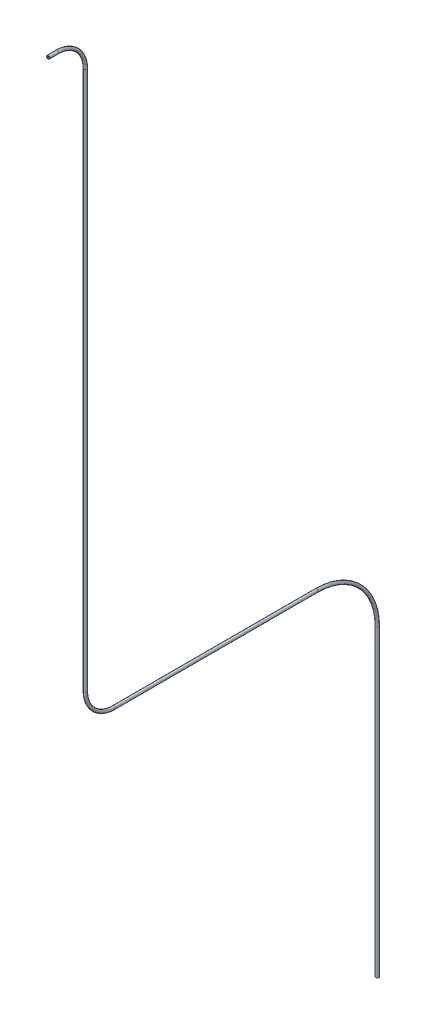
ISO-10303-21;
HEADER;
FILE_DESCRIPTION(('STEP AP214'),'2;1');
FILE_NAME('part.step','',(''),(''),'','','');
FILE_SCHEMA(('AUTOMOTIVE_DESIGN { 1 0 10303 214 1 1 1 1 }'));
ENDSEC;
DATA;
#1=APPLICATION_CONTEXT('core data for automotive mechanical design processes');
#2=APPLICATION_PROTOCOL_DEFINITION('international standard','automotive_design',2000,#1);
#3=PRODUCT_CONTEXT('',#1,'mechanical');
#4=PRODUCT('Part','Part','',(#3));
#5=PRODUCT_RELATED_PRODUCT_CATEGORY('part','',(#4));
#6=PRODUCT_DEFINITION_FORMATION('','',#4);
#7=PRODUCT_DEFINITION_CONTEXT('part definition',#1,'design');
#8=PRODUCT_DEFINITION('design','',#6,#7);
#9=PRODUCT_DEFINITION_SHAPE('','',#8);
#10=(LENGTH_UNIT() NAMED_UNIT(*) SI_UNIT(.MILLI.,.METRE.));
#11=(NAMED_UNIT(*) PLANE_ANGLE_UNIT() SI_UNIT($,.RADIAN.));
#12=(NAMED_UNIT(*) SI_UNIT($,.STERADIAN.) SOLID_ANGLE_UNIT());
#13=UNCERTAINTY_MEASURE_WITH_UNIT(LENGTH_MEASURE(1.E-05),#10,'distance_accuracy_value','');
#14=(GEOMETRIC_REPRESENTATION_CONTEXT(3) GLOBAL_UNCERTAINTY_ASSIGNED_CONTEXT((#13)) GLOBAL_UNIT_ASSIGNED_CONTEXT((#10,
#11,#12)) REPRESENTATION_CONTEXT('',''));
#15=CARTESIAN_POINT('',(0.,0.,0.));
#16=DIRECTION('',(0.,0.,1.));
#17=DIRECTION('',(1.,0.,0.));
#18=AXIS2_PLACEMENT_3D('',#15,#16,#17);
#19=CARTESIAN_POINT('',(0.,0.,0.));
#20=DIRECTION('',(0.,0.,1.));
#21=DIRECTION('',(-1.,0.,0.));
#22=AXIS2_PLACEMENT_3D('',#19,#20,#21);
#23=PLANE('',#22);
#24=CARTESIAN_POINT('',(0.,0.,0.));
#25=DIRECTION('',(0.,0.,1.));
#26=DIRECTION('',(-1.,0.,0.));
#27=AXIS2_PLACEMENT_3D('',#24,#25,#26);
#28=CIRCLE('',#27,0.19);
#29=CARTESIAN_POINT('',(-0.19,0.,0.));
#30=VERTEX_POINT('',#29);
#31=EDGE_CURVE('E261',#30,#30,#28,.T.);
#32=ORIENTED_EDGE('',*,*,#31,.F.);
#33=EDGE_LOOP('',(#32));
#34=FACE_BOUND('',#33,.T.);
#35=CARTESIAN_POINT('',(0.,0.,0.));
#36=DIRECTION('',(0.,0.,1.));
#37=DIRECTION('',(0.,-1.,0.));
#38=AXIS2_PLACEMENT_3D('',#35,#36,#37);
#39=CIRCLE('',#38,0.39);
#40=CARTESIAN_POINT('',(0.,-0.39,0.));
#41=VERTEX_POINT('',#40);
#42=EDGE_CURVE('E70',#41,#41,#39,.T.);
#43=ORIENTED_EDGE('',*,*,#42,.T.);
#44=EDGE_LOOP('',(#43));
#45=FACE_BOUND('',#44,.T.);
#46=ADVANCED_FACE('F51',(#34,#45),#23,.T.);
#47=CARTESIAN_POINT('',(0.,-237.,-81.2));
#48=DIRECTION('',(0.,1.,0.));
#49=DIRECTION('',(-1.,0.,0.));
#50=AXIS2_PLACEMENT_3D('',#47,#48,#49);
#51=PLANE('',#50);
#52=CARTESIAN_POINT('',(0.,-237.,-81.2));
#53=DIRECTION('',(0.,1.,0.));
#54=DIRECTION('',(-1.,0.,0.));
#55=AXIS2_PLACEMENT_3D('',#52,#53,#54);
#56=CIRCLE('',#55,0.19);
#57=CARTESIAN_POINT('',(-0.19,-237.,-81.2));
#58=VERTEX_POINT('',#57);
#59=EDGE_CURVE('E73',#58,#58,#56,.T.);
#60=ORIENTED_EDGE('',*,*,#59,.T.);
#61=EDGE_LOOP('',(#60));
#62=FACE_BOUND('',#61,.T.);
#63=CARTESIAN_POINT('',(0.,-237.,-81.2));
#64=DIRECTION('',(0.,1.,0.));
#65=DIRECTION('',(-1.,0.,0.));
#66=AXIS2_PLACEMENT_3D('',#63,#64,#65);
#67=CIRCLE('',#66,0.39);
#68=CARTESIAN_POINT('',(-0.39,-237.,-81.2));
#69=VERTEX_POINT('',#68);
#70=EDGE_CURVE('E11',#69,#69,#67,.T.);
#71=ORIENTED_EDGE('',*,*,#70,.F.);
#72=EDGE_LOOP('',(#71));
#73=FACE_BOUND('',#72,.T.);
#74=ADVANCED_FACE('F147',(#62,#73),#51,.F.);
#75=CARTESIAN_POINT('',(0.,0.,0.));
#76=DIRECTION('',(0.,0.,-1.));
#77=DIRECTION('',(-1.,0.,0.));
#78=AXIS2_PLACEMENT_3D('',#75,#76,#77);
#79=CYLINDRICAL_SURFACE('',#78,0.39);
#80=CARTESIAN_POINT('',(0.,0.,-2.20000000000001));
#81=DIRECTION('',(0.,0.,-1.));
#82=DIRECTION('',(-1.,0.,0.));
#83=AXIS2_PLACEMENT_3D('',#80,#81,#82);
#84=CIRCLE('',#83,0.39);
#85=CARTESIAN_POINT('',(0.,0.389999999999999,-2.20000000000001));
#86=VERTEX_POINT('',#85);
#87=EDGE_CURVE('E72',#86,#86,#84,.F.);
#88=ORIENTED_EDGE('',*,*,#87,.T.);
#89=EDGE_LOOP('',(#88));
#90=FACE_BOUND('',#89,.T.);
#91=ORIENTED_EDGE('',*,*,#42,.F.);
#92=EDGE_LOOP('',(#91));
#93=FACE_BOUND('',#92,.T.);
#94=ADVANCED_FACE('F150',(#90,#93),#79,.T.);
#95=CARTESIAN_POINT('',(0.,-7.,-2.2));
#96=DIRECTION('',(-1.,0.,0.));
#97=DIRECTION('',(0.,0.,1.));
#98=AXIS2_PLACEMENT_3D('',#95,#96,#97);
#99=TOROIDAL_SURFACE('',#98,7.,0.39);
#100=CARTESIAN_POINT('',(0.,-6.99999999999981,-9.2));
#101=DIRECTION('',(0.,1.,0.));
#102=DIRECTION('',(0.,0.,1.));
#103=AXIS2_PLACEMENT_3D('',#100,#101,#102);
#104=CIRCLE('',#103,0.39);
#105=CARTESIAN_POINT('',(0.,-6.9999999999998,-9.59));
#106=VERTEX_POINT('',#105);
#107=EDGE_CURVE('E77',#106,#106,#104,.T.);
#108=CARTESIAN_POINT('',(0.,-7.,-2.2));
#109=DIRECTION('',(-1.,0.,0.));
#110=DIRECTION('',(0.,0.,1.));
#111=AXIS2_PLACEMENT_3D('',#108,#109,#110);
#112=CIRCLE('',#111,7.39);
#113=EDGE_CURVE('',#86,#106,#112,.T.);
#114=ORIENTED_EDGE('',*,*,#87,.F.);
#115=ORIENTED_EDGE('',*,*,#107,.T.);
#116=ORIENTED_EDGE('',*,*,#113,.T.);
#117=ORIENTED_EDGE('',*,*,#113,.F.);
#118=EDGE_LOOP('',(#114,#116,#115,#117));
#119=FACE_BOUND('',#118,.T.);
#120=ADVANCED_FACE('F156',(#119),#99,.T.);
#121=CARTESIAN_POINT('',(0.,-7.00000000000006,-9.19999999999996));
#122=DIRECTION('',(0.,-1.,0.));
#123=DIRECTION('',(0.,0.,-1.));
#124=AXIS2_PLACEMENT_3D('',#121,#122,#123);
#125=CYLINDRICAL_SURFACE('',#124,0.39);
#126=CARTESIAN_POINT('',(0.,-140.,-9.19999999999996));
#127=DIRECTION('',(0.,-1.,0.));
#128=DIRECTION('',(0.,0.,-1.));
#129=AXIS2_PLACEMENT_3D('',#126,#127,#128);
#130=CIRCLE('',#129,0.39);
#131=CARTESIAN_POINT('',(0.,-140.,-8.80999999999996));
#132=VERTEX_POINT('',#131);
#133=EDGE_CURVE('E91',#132,#132,#130,.F.);
#134=ORIENTED_EDGE('',*,*,#133,.T.);
#135=EDGE_LOOP('',(#134));
#136=FACE_BOUND('',#135,.T.);
#137=ORIENTED_EDGE('',*,*,#107,.F.);
#138=EDGE_LOOP('',(#137));
#139=FACE_BOUND('',#138,.T.);
#140=ADVANCED_FACE('F108',(#136,#139),#125,.T.);
#141=CARTESIAN_POINT('',(0.,-140.,-16.2));
#142=DIRECTION('',(1.,0.,0.));
#143=DIRECTION('',(0.,0.,-1.));
#144=AXIS2_PLACEMENT_3D('',#141,#142,#143);
#145=TOROIDAL_SURFACE('',#144,7.00000000000002,0.39);
#146=CARTESIAN_POINT('',(0.,-147.,-16.2));
#147=DIRECTION('',(0.,0.,1.));
#148=DIRECTION('',(0.,-1.,0.));
#149=AXIS2_PLACEMENT_3D('',#146,#147,#148);
#150=CIRCLE('',#149,0.39);
#151=CARTESIAN_POINT('',(0.,-147.39,-16.2));
#152=VERTEX_POINT('',#151);
#153=EDGE_CURVE('E67',#152,#152,#150,.T.);
#154=CARTESIAN_POINT('',(0.,-140.,-16.2));
#155=DIRECTION('',(1.,0.,0.));
#156=DIRECTION('',(0.,0.,-1.));
#157=AXIS2_PLACEMENT_3D('',#154,#155,#156);
#158=CIRCLE('',#157,7.39000000000002);
#159=EDGE_CURVE('',#132,#152,#158,.T.);
#160=ORIENTED_EDGE('',*,*,#133,.F.);
#161=ORIENTED_EDGE('',*,*,#153,.T.);
#162=ORIENTED_EDGE('',*,*,#159,.T.);
#163=ORIENTED_EDGE('',*,*,#159,.F.);
#164=EDGE_LOOP('',(#160,#162,#161,#163));
#165=FACE_BOUND('',#164,.T.);
#166=ADVANCED_FACE('F96',(#165),#145,.T.);
#167=CARTESIAN_POINT('',(0.,-147.,-16.2));
#168=DIRECTION('',(0.,0.,-1.));
#169=DIRECTION('',(-1.,0.,0.));
#170=AXIS2_PLACEMENT_3D('',#167,#168,#169);
#171=CYLINDRICAL_SURFACE('',#170,0.39);
#172=CARTESIAN_POINT('',(0.,-147.,-66.2));
#173=DIRECTION('',(0.,0.,-1.));
#174=DIRECTION('',(-1.,0.,0.));
#175=AXIS2_PLACEMENT_3D('',#172,#173,#174);
#176=CIRCLE('',#175,0.39);
#177=CARTESIAN_POINT('',(0.,-146.61,-66.2));
#178=VERTEX_POINT('',#177);
#179=EDGE_CURVE('E62',#178,#178,#176,.F.);
#180=ORIENTED_EDGE('',*,*,#179,.T.);
#181=EDGE_LOOP('',(#180));
#182=FACE_BOUND('',#181,.T.);
#183=ORIENTED_EDGE('',*,*,#153,.F.);
#184=EDGE_LOOP('',(#183));
#185=FACE_BOUND('',#184,.T.);
#186=ADVANCED_FACE('F99',(#182,#185),#171,.T.);
#187=CARTESIAN_POINT('',(0.,-162.,-66.2));
#188=DIRECTION('',(-1.,0.,0.));
#189=DIRECTION('',(0.,0.,1.));
#190=AXIS2_PLACEMENT_3D('',#187,#188,#189);
#191=TOROIDAL_SURFACE('',#190,15.,0.39);
#192=CARTESIAN_POINT('',(0.,-162.,-81.2));
#193=DIRECTION('',(0.,1.,0.));
#194=DIRECTION('',(0.,0.,1.));
#195=AXIS2_PLACEMENT_3D('',#192,#193,#194);
#196=CIRCLE('',#195,0.39);
#197=CARTESIAN_POINT('',(0.,-162.,-81.59));
#198=VERTEX_POINT('',#197);
#199=EDGE_CURVE('E58',#198,#198,#196,.T.);
#200=CARTESIAN_POINT('',(0.,-162.,-66.2));
#201=DIRECTION('',(-1.,0.,0.));
#202=DIRECTION('',(0.,0.,1.));
#203=AXIS2_PLACEMENT_3D('',#200,#201,#202);
#204=CIRCLE('',#203,15.39);
#205=EDGE_CURVE('',#178,#198,#204,.T.);
#206=ORIENTED_EDGE('',*,*,#179,.F.);
#207=ORIENTED_EDGE('',*,*,#199,.T.);
#208=ORIENTED_EDGE('',*,*,#205,.T.);
#209=ORIENTED_EDGE('',*,*,#205,.F.);
#210=EDGE_LOOP('',(#206,#208,#207,#209));
#211=FACE_BOUND('',#210,.T.);
#212=ADVANCED_FACE('F101',(#211),#191,.T.);
#213=CARTESIAN_POINT('',(0.,-162.,-81.2));
#214=DIRECTION('',(0.,-1.,0.));
#215=DIRECTION('',(0.,0.,-1.));
#216=AXIS2_PLACEMENT_3D('',#213,#214,#215);
#217=CYLINDRICAL_SURFACE('',#216,0.39);
#218=ORIENTED_EDGE('',*,*,#70,.T.);
#219=EDGE_LOOP('',(#218));
#220=FACE_BOUND('',#219,.T.);
#221=ORIENTED_EDGE('',*,*,#199,.F.);
#222=EDGE_LOOP('',(#221));
#223=FACE_BOUND('',#222,.T.);
#224=ADVANCED_FACE('F53',(#220,#223),#217,.T.);
#225=CARTESIAN_POINT('',(0.,0.,0.));
#226=DIRECTION('',(0.,0.,-1.));
#227=DIRECTION('',(-1.,0.,0.));
#228=AXIS2_PLACEMENT_3D('',#225,#226,#227);
#229=CYLINDRICAL_SURFACE('',#228,0.19);
#230=CARTESIAN_POINT('',(0.,0.,-2.20000000000001));
#231=DIRECTION('',(0.,0.,1.));
#232=DIRECTION('',(-1.,0.,0.));
#233=AXIS2_PLACEMENT_3D('',#230,#231,#232);
#234=CIRCLE('',#233,0.19);
#235=CARTESIAN_POINT('',(0.,0.189999999999999,-2.20000000000001));
#236=VERTEX_POINT('',#235);
#237=EDGE_CURVE('E262',#236,#236,#234,.T.);
#238=ORIENTED_EDGE('',*,*,#237,.F.);
#239=EDGE_LOOP('',(#238));
#240=FACE_BOUND('',#239,.T.);
#241=ORIENTED_EDGE('',*,*,#31,.T.);
#242=EDGE_LOOP('',(#241));
#243=FACE_BOUND('',#242,.T.);
#244=ADVANCED_FACE('F111',(#240,#243),#229,.F.);
#245=CARTESIAN_POINT('',(0.,-7.,-2.2));
#246=DIRECTION('',(-1.,0.,0.));
#247=DIRECTION('',(0.,0.,1.));
#248=AXIS2_PLACEMENT_3D('',#245,#246,#247);
#249=TOROIDAL_SURFACE('',#248,7.,0.19);
#250=CARTESIAN_POINT('',(0.,-6.99999999999981,-9.20000000000078));
#251=DIRECTION('',(0.,1.,0.));
#252=DIRECTION('',(-1.,0.,0.));
#253=AXIS2_PLACEMENT_3D('',#250,#251,#252);
#254=CIRCLE('',#253,0.19);
#255=CARTESIAN_POINT('',(0.,-6.99999999999981,-9.39));
#256=VERTEX_POINT('',#255);
#257=EDGE_CURVE('E265',#256,#256,#254,.T.);
#258=CARTESIAN_POINT('',(0.,-7.,-2.2));
#259=DIRECTION('',(-1.,0.,0.));
#260=DIRECTION('',(0.,0.,1.));
#261=AXIS2_PLACEMENT_3D('',#258,#259,#260);
#262=CIRCLE('',#261,7.19);
#263=EDGE_CURVE('',#236,#256,#262,.T.);
#264=ORIENTED_EDGE('',*,*,#237,.T.);
#265=ORIENTED_EDGE('',*,*,#257,.F.);
#266=ORIENTED_EDGE('',*,*,#263,.T.);
#267=ORIENTED_EDGE('',*,*,#263,.F.);
#268=EDGE_LOOP('',(#264,#266,#265,#267));
#269=FACE_BOUND('',#268,.T.);
#270=ADVANCED_FACE('F115',(#269),#249,.F.);
#271=CARTESIAN_POINT('',(0.,-7.00000000000006,-9.19999999999996));
#272=DIRECTION('',(0.,-1.,0.));
#273=DIRECTION('',(0.,0.,-1.));
#274=AXIS2_PLACEMENT_3D('',#271,#272,#273);
#275=CYLINDRICAL_SURFACE('',#274,0.19);
#276=CARTESIAN_POINT('',(0.,-140.,-9.19999999999996));
#277=DIRECTION('',(0.,1.,0.));
#278=DIRECTION('',(-1.,0.,0.));
#279=AXIS2_PLACEMENT_3D('',#276,#277,#278);
#280=CIRCLE('',#279,0.19);
#281=CARTESIAN_POINT('',(0.,-140.,-9.00999999999996));
#282=VERTEX_POINT('',#281);
#283=EDGE_CURVE('E270',#282,#282,#280,.T.);
#284=ORIENTED_EDGE('',*,*,#283,.F.);
#285=EDGE_LOOP('',(#284));
#286=FACE_BOUND('',#285,.T.);
#287=ORIENTED_EDGE('',*,*,#257,.T.);
#288=EDGE_LOOP('',(#287));
#289=FACE_BOUND('',#288,.T.);
#290=ADVANCED_FACE('F122',(#286,#289),#275,.F.);
#291=CARTESIAN_POINT('',(0.,-140.,-16.2));
#292=DIRECTION('',(1.,0.,0.));
#293=DIRECTION('',(0.,0.,-1.));
#294=AXIS2_PLACEMENT_3D('',#291,#292,#293);
#295=TOROIDAL_SURFACE('',#294,7.00000000000002,0.19);
#296=CARTESIAN_POINT('',(0.,-147.,-16.2));
#297=DIRECTION('',(0.,0.,1.));
#298=DIRECTION('',(-1.,0.,0.));
#299=AXIS2_PLACEMENT_3D('',#296,#297,#298);
#300=CIRCLE('',#299,0.19);
#301=CARTESIAN_POINT('',(0.,-147.19,-16.2));
#302=VERTEX_POINT('',#301);
#303=EDGE_CURVE('E273',#302,#302,#300,.T.);
#304=CARTESIAN_POINT('',(0.,-140.,-16.2));
#305=DIRECTION('',(1.,0.,0.));
#306=DIRECTION('',(0.,0.,-1.));
#307=AXIS2_PLACEMENT_3D('',#304,#305,#306);
#308=CIRCLE('',#307,7.19000000000002);
#309=EDGE_CURVE('',#282,#302,#308,.T.);
#310=ORIENTED_EDGE('',*,*,#283,.T.);
#311=ORIENTED_EDGE('',*,*,#303,.F.);
#312=ORIENTED_EDGE('',*,*,#309,.T.);
#313=ORIENTED_EDGE('',*,*,#309,.F.);
#314=EDGE_LOOP('',(#310,#312,#311,#313));
#315=FACE_BOUND('',#314,.T.);
#316=ADVANCED_FACE('F130',(#315),#295,.F.);
#317=CARTESIAN_POINT('',(0.,-147.,-16.2));
#318=DIRECTION('',(0.,0.,-1.));
#319=DIRECTION('',(-1.,0.,0.));
#320=AXIS2_PLACEMENT_3D('',#317,#318,#319);
#321=CYLINDRICAL_SURFACE('',#320,0.19);
#322=CARTESIAN_POINT('',(0.,-147.,-66.2));
#323=DIRECTION('',(0.,0.,1.));
#324=DIRECTION('',(-1.,0.,0.));
#325=AXIS2_PLACEMENT_3D('',#322,#323,#324);
#326=CIRCLE('',#325,0.19);
#327=CARTESIAN_POINT('',(0.,-146.81,-66.2));
#328=VERTEX_POINT('',#327);
#329=EDGE_CURVE('E85',#328,#328,#326,.T.);
#330=ORIENTED_EDGE('',*,*,#329,.F.);
#331=EDGE_LOOP('',(#330));
#332=FACE_BOUND('',#331,.T.);
#333=ORIENTED_EDGE('',*,*,#303,.T.);
#334=EDGE_LOOP('',(#333));
#335=FACE_BOUND('',#334,.T.);
#336=ADVANCED_FACE('F134',(#332,#335),#321,.F.);
#337=CARTESIAN_POINT('',(0.,-162.,-66.2));
#338=DIRECTION('',(-1.,0.,0.));
#339=DIRECTION('',(0.,0.,1.));
#340=AXIS2_PLACEMENT_3D('',#337,#338,#339);
#341=TOROIDAL_SURFACE('',#340,15.,0.19);
#342=CARTESIAN_POINT('',(0.,-162.,-81.1999999999995));
#343=DIRECTION('',(0.,1.,0.));
#344=DIRECTION('',(-1.,0.,0.));
#345=AXIS2_PLACEMENT_3D('',#342,#343,#344);
#346=CIRCLE('',#345,0.19);
#347=CARTESIAN_POINT('',(0.,-162.,-81.39));
#348=VERTEX_POINT('',#347);
#349=EDGE_CURVE('E80',#348,#348,#346,.T.);
#350=CARTESIAN_POINT('',(0.,-162.,-66.2));
#351=DIRECTION('',(-1.,0.,0.));
#352=DIRECTION('',(0.,0.,1.));
#353=AXIS2_PLACEMENT_3D('',#350,#351,#352);
#354=CIRCLE('',#353,15.19);
#355=EDGE_CURVE('',#328,#348,#354,.T.);
#356=ORIENTED_EDGE('',*,*,#329,.T.);
#357=ORIENTED_EDGE('',*,*,#349,.F.);
#358=ORIENTED_EDGE('',*,*,#355,.T.);
#359=ORIENTED_EDGE('',*,*,#355,.F.);
#360=EDGE_LOOP('',(#356,#358,#357,#359));
#361=FACE_BOUND('',#360,.T.);
#362=ADVANCED_FACE('F138',(#361),#341,.F.);
#363=CARTESIAN_POINT('',(0.,-162.,-81.2));
#364=DIRECTION('',(0.,-1.,0.));
#365=DIRECTION('',(0.,0.,-1.));
#366=AXIS2_PLACEMENT_3D('',#363,#364,#365);
#367=CYLINDRICAL_SURFACE('',#366,0.19);
#368=ORIENTED_EDGE('',*,*,#59,.F.);
#369=EDGE_LOOP('',(#368));
#370=FACE_BOUND('',#369,.T.);
#371=ORIENTED_EDGE('',*,*,#349,.T.);
#372=EDGE_LOOP('',(#371));
#373=FACE_BOUND('',#372,.T.);
#374=ADVANCED_FACE('F142',(#370,#373),#367,.F.);
#375=CLOSED_SHELL('',(#46,#74,#94,#120,#140,#166,#186,#212,#224,#244,#270,#290,#316,#336,#362,#374));
#376=MANIFOLD_SOLID_BREP('B2',#375);
#377=ADVANCED_BREP_SHAPE_REPRESENTATION('',(#18,#376),#14);
#378=SHAPE_DEFINITION_REPRESENTATION(#9,#377);
ENDSEC;
END-ISO-10303-21;
